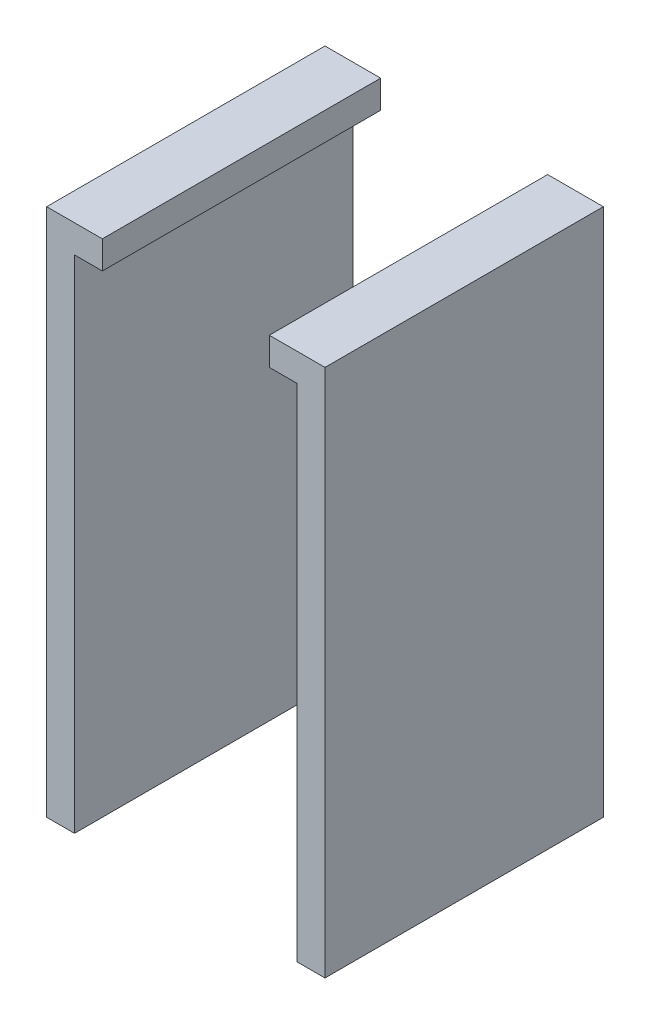
ISO-10303-21;
HEADER;
FILE_DESCRIPTION(('STEP AP214'),'2;1');
FILE_NAME('part.step','',(''),(''),'','','');
FILE_SCHEMA(('AUTOMOTIVE_DESIGN { 1 0 10303 214 1 1 1 1 }'));
ENDSEC;
DATA;
#1=APPLICATION_CONTEXT('core data for automotive mechanical design processes');
#2=APPLICATION_PROTOCOL_DEFINITION('international standard','automotive_design',2000,#1);
#3=PRODUCT_CONTEXT('',#1,'mechanical');
#4=PRODUCT('Part','Part','',(#3));
#5=PRODUCT_RELATED_PRODUCT_CATEGORY('part','',(#4));
#6=PRODUCT_DEFINITION_FORMATION('','',#4);
#7=PRODUCT_DEFINITION_CONTEXT('part definition',#1,'design');
#8=PRODUCT_DEFINITION('design','',#6,#7);
#9=PRODUCT_DEFINITION_SHAPE('','',#8);
#10=(LENGTH_UNIT() NAMED_UNIT(*) SI_UNIT(.MILLI.,.METRE.));
#11=(NAMED_UNIT(*) PLANE_ANGLE_UNIT() SI_UNIT($,.RADIAN.));
#12=(NAMED_UNIT(*) SI_UNIT($,.STERADIAN.) SOLID_ANGLE_UNIT());
#13=UNCERTAINTY_MEASURE_WITH_UNIT(LENGTH_MEASURE(1.E-05),#10,'distance_accuracy_value','');
#14=(GEOMETRIC_REPRESENTATION_CONTEXT(3) GLOBAL_UNCERTAINTY_ASSIGNED_CONTEXT((#13)) GLOBAL_UNIT_ASSIGNED_CONTEXT((#10,
#11,#12)) REPRESENTATION_CONTEXT('',''));
#15=CARTESIAN_POINT('',(0.,0.,0.));
#16=DIRECTION('',(0.,0.,1.));
#17=DIRECTION('',(1.,0.,0.));
#18=AXIS2_PLACEMENT_3D('',#15,#16,#17);
#19=CARTESIAN_POINT('',(150.,0.,150.));
#20=DIRECTION('',(0.,1.,0.));
#21=DIRECTION('',(-1.,0.,0.));
#22=AXIS2_PLACEMENT_3D('',#19,#20,#21);
#23=PLANE('',#22);
#24=DIRECTION('',(1.,0.,0.));
#25=VECTOR('',#24,1.);
#26=CARTESIAN_POINT('',(150.,0.,0.));
#27=LINE('',#26,#25);
#28=CARTESIAN_POINT('',(135.,0.,0.));
#29=VERTEX_POINT('',#28);
#30=CARTESIAN_POINT('',(150.,0.,0.));
#31=VERTEX_POINT('',#30);
#32=EDGE_CURVE('E12',#29,#31,#27,.T.);
#33=ORIENTED_EDGE('',*,*,#32,.T.);
#34=DIRECTION('',(0.,0.,-1.));
#35=VECTOR('',#34,1.);
#36=CARTESIAN_POINT('',(150.,0.,150.));
#37=LINE('',#36,#35);
#38=CARTESIAN_POINT('',(150.,0.,150.));
#39=VERTEX_POINT('',#38);
#40=EDGE_CURVE('E149',#39,#31,#37,.T.);
#41=ORIENTED_EDGE('',*,*,#40,.F.);
#42=DIRECTION('',(1.,0.,0.));
#43=VECTOR('',#42,1.);
#44=CARTESIAN_POINT('',(150.,0.,150.));
#45=LINE('',#44,#43);
#46=CARTESIAN_POINT('',(135.,0.,150.));
#47=VERTEX_POINT('',#46);
#48=EDGE_CURVE('E51',#47,#39,#45,.T.);
#49=ORIENTED_EDGE('',*,*,#48,.F.);
#50=DIRECTION('',(0.,0.,-1.));
#51=VECTOR('',#50,1.);
#52=CARTESIAN_POINT('',(135.,0.,150.));
#53=LINE('',#52,#51);
#54=EDGE_CURVE('E137',#47,#29,#53,.T.);
#55=ORIENTED_EDGE('',*,*,#54,.T.);
#56=EDGE_LOOP('',(#33,#41,#49,#55));
#57=FACE_BOUND('',#56,.T.);
#58=ADVANCED_FACE('F47',(#57),#23,.F.);
#59=CARTESIAN_POINT('',(150.,285.,150.));
#60=DIRECTION('',(-1.,0.,0.));
#61=DIRECTION('',(0.,-1.,0.));
#62=AXIS2_PLACEMENT_3D('',#59,#60,#61);
#63=PLANE('',#62);
#64=DIRECTION('',(0.,1.,0.));
#65=VECTOR('',#64,1.);
#66=CARTESIAN_POINT('',(150.,285.,0.));
#67=LINE('',#66,#65);
#68=CARTESIAN_POINT('',(150.,285.,0.));
#69=VERTEX_POINT('',#68);
#70=EDGE_CURVE('E57',#31,#69,#67,.T.);
#71=ORIENTED_EDGE('',*,*,#70,.T.);
#72=DIRECTION('',(0.,0.,-1.));
#73=VECTOR('',#72,1.);
#74=CARTESIAN_POINT('',(150.,285.,150.));
#75=LINE('',#74,#73);
#76=CARTESIAN_POINT('',(150.,285.,150.));
#77=VERTEX_POINT('',#76);
#78=EDGE_CURVE('E115',#77,#69,#75,.T.);
#79=ORIENTED_EDGE('',*,*,#78,.F.);
#80=DIRECTION('',(0.,1.,0.));
#81=VECTOR('',#80,1.);
#82=CARTESIAN_POINT('',(150.,285.,150.));
#83=LINE('',#82,#81);
#84=EDGE_CURVE('E87',#39,#77,#83,.T.);
#85=ORIENTED_EDGE('',*,*,#84,.F.);
#86=ORIENTED_EDGE('',*,*,#40,.T.);
#87=EDGE_LOOP('',(#71,#79,#85,#86));
#88=FACE_BOUND('',#87,.T.);
#89=ADVANCED_FACE('F150',(#88),#63,.F.);
#90=CARTESIAN_POINT('',(120.,285.,150.));
#91=DIRECTION('',(0.,-1.,0.));
#92=DIRECTION('',(0.,0.,-1.));
#93=AXIS2_PLACEMENT_3D('',#90,#91,#92);
#94=PLANE('',#93);
#95=DIRECTION('',(-1.,0.,0.));
#96=VECTOR('',#95,1.);
#97=CARTESIAN_POINT('',(120.,285.,0.));
#98=LINE('',#97,#96);
#99=CARTESIAN_POINT('',(120.,285.,0.));
#100=VERTEX_POINT('',#99);
#101=EDGE_CURVE('E109',#69,#100,#98,.T.);
#102=ORIENTED_EDGE('',*,*,#101,.T.);
#103=DIRECTION('',(0.,0.,-1.));
#104=VECTOR('',#103,1.);
#105=CARTESIAN_POINT('',(120.,285.,150.));
#106=LINE('',#105,#104);
#107=CARTESIAN_POINT('',(120.,285.,150.));
#108=VERTEX_POINT('',#107);
#109=EDGE_CURVE('E113',#108,#100,#106,.T.);
#110=ORIENTED_EDGE('',*,*,#109,.F.);
#111=DIRECTION('',(-1.,0.,0.));
#112=VECTOR('',#111,1.);
#113=CARTESIAN_POINT('',(120.,285.,150.));
#114=LINE('',#113,#112);
#115=EDGE_CURVE('E140',#77,#108,#114,.T.);
#116=ORIENTED_EDGE('',*,*,#115,.F.);
#117=ORIENTED_EDGE('',*,*,#78,.T.);
#118=EDGE_LOOP('',(#102,#110,#116,#117));
#119=FACE_BOUND('',#118,.T.);
#120=ADVANCED_FACE('F111',(#119),#94,.F.);
#121=CARTESIAN_POINT('',(120.,270.,150.));
#122=DIRECTION('',(1.,0.,0.));
#123=DIRECTION('',(0.,1.,0.));
#124=AXIS2_PLACEMENT_3D('',#121,#122,#123);
#125=PLANE('',#124);
#126=DIRECTION('',(0.,-1.,0.));
#127=VECTOR('',#126,1.);
#128=CARTESIAN_POINT('',(120.,270.,0.));
#129=LINE('',#128,#127);
#130=CARTESIAN_POINT('',(120.,270.,0.));
#131=VERTEX_POINT('',#130);
#132=EDGE_CURVE('E117',#100,#131,#129,.T.);
#133=ORIENTED_EDGE('',*,*,#132,.T.);
#134=DIRECTION('',(0.,0.,-1.));
#135=VECTOR('',#134,1.);
#136=CARTESIAN_POINT('',(120.,270.,150.));
#137=LINE('',#136,#135);
#138=CARTESIAN_POINT('',(120.,270.,150.));
#139=VERTEX_POINT('',#138);
#140=EDGE_CURVE('E124',#139,#131,#137,.T.);
#141=ORIENTED_EDGE('',*,*,#140,.F.);
#142=DIRECTION('',(0.,-1.,0.));
#143=VECTOR('',#142,1.);
#144=CARTESIAN_POINT('',(120.,270.,150.));
#145=LINE('',#144,#143);
#146=EDGE_CURVE('E123',#108,#139,#145,.T.);
#147=ORIENTED_EDGE('',*,*,#146,.F.);
#148=ORIENTED_EDGE('',*,*,#109,.T.);
#149=EDGE_LOOP('',(#133,#141,#147,#148));
#150=FACE_BOUND('',#149,.T.);
#151=ADVANCED_FACE('F120',(#150),#125,.F.);
#152=CARTESIAN_POINT('',(135.,270.,150.));
#153=DIRECTION('',(0.,1.,0.));
#154=DIRECTION('',(-1.,0.,0.));
#155=AXIS2_PLACEMENT_3D('',#152,#153,#154);
#156=PLANE('',#155);
#157=DIRECTION('',(1.,0.,0.));
#158=VECTOR('',#157,1.);
#159=CARTESIAN_POINT('',(135.,270.,0.));
#160=LINE('',#159,#158);
#161=CARTESIAN_POINT('',(135.,270.,0.));
#162=VERTEX_POINT('',#161);
#163=EDGE_CURVE('E128',#131,#162,#160,.T.);
#164=ORIENTED_EDGE('',*,*,#163,.T.);
#165=DIRECTION('',(0.,0.,-1.));
#166=VECTOR('',#165,1.);
#167=CARTESIAN_POINT('',(135.,270.,150.));
#168=LINE('',#167,#166);
#169=CARTESIAN_POINT('',(135.,270.,150.));
#170=VERTEX_POINT('',#169);
#171=EDGE_CURVE('E145',#170,#162,#168,.T.);
#172=ORIENTED_EDGE('',*,*,#171,.F.);
#173=DIRECTION('',(1.,0.,0.));
#174=VECTOR('',#173,1.);
#175=CARTESIAN_POINT('',(135.,270.,150.));
#176=LINE('',#175,#174);
#177=EDGE_CURVE('E136',#139,#170,#176,.T.);
#178=ORIENTED_EDGE('',*,*,#177,.F.);
#179=ORIENTED_EDGE('',*,*,#140,.T.);
#180=EDGE_LOOP('',(#164,#172,#178,#179));
#181=FACE_BOUND('',#180,.T.);
#182=ADVANCED_FACE('F157',(#181),#156,.F.);
#183=CARTESIAN_POINT('',(135.,0.,150.));
#184=DIRECTION('',(1.,0.,0.));
#185=DIRECTION('',(0.,0.,-1.));
#186=AXIS2_PLACEMENT_3D('',#183,#184,#185);
#187=PLANE('',#186);
#188=DIRECTION('',(0.,-1.,0.));
#189=VECTOR('',#188,1.);
#190=CARTESIAN_POINT('',(135.,0.,0.));
#191=LINE('',#190,#189);
#192=EDGE_CURVE('E98',#162,#29,#191,.T.);
#193=ORIENTED_EDGE('',*,*,#192,.T.);
#194=ORIENTED_EDGE('',*,*,#54,.F.);
#195=DIRECTION('',(0.,-1.,0.));
#196=VECTOR('',#195,1.);
#197=CARTESIAN_POINT('',(135.,0.,150.));
#198=LINE('',#197,#196);
#199=EDGE_CURVE('E134',#170,#47,#198,.T.);
#200=ORIENTED_EDGE('',*,*,#199,.F.);
#201=ORIENTED_EDGE('',*,*,#171,.T.);
#202=EDGE_LOOP('',(#193,#194,#200,#201));
#203=FACE_BOUND('',#202,.T.);
#204=ADVANCED_FACE('F153',(#203),#187,.F.);
#205=CARTESIAN_POINT('',(0.,0.,150.));
#206=DIRECTION('',(0.,0.,-1.));
#207=DIRECTION('',(-1.,0.,0.));
#208=AXIS2_PLACEMENT_3D('',#205,#206,#207);
#209=PLANE('',#208);
#210=ORIENTED_EDGE('',*,*,#48,.T.);
#211=ORIENTED_EDGE('',*,*,#84,.T.);
#212=ORIENTED_EDGE('',*,*,#115,.T.);
#213=ORIENTED_EDGE('',*,*,#146,.T.);
#214=ORIENTED_EDGE('',*,*,#177,.T.);
#215=ORIENTED_EDGE('',*,*,#199,.T.);
#216=EDGE_LOOP('',(#210,#211,#212,#213,#214,#215));
#217=FACE_BOUND('',#216,.T.);
#218=ADVANCED_FACE('F49',(#217),#209,.F.);
#219=CARTESIAN_POINT('',(0.,0.,0.));
#220=DIRECTION('',(0.,0.,-1.));
#221=DIRECTION('',(-1.,0.,0.));
#222=AXIS2_PLACEMENT_3D('',#219,#220,#221);
#223=PLANE('',#222);
#224=ORIENTED_EDGE('',*,*,#32,.F.);
#225=ORIENTED_EDGE('',*,*,#192,.F.);
#226=ORIENTED_EDGE('',*,*,#163,.F.);
#227=ORIENTED_EDGE('',*,*,#132,.F.);
#228=ORIENTED_EDGE('',*,*,#101,.F.);
#229=ORIENTED_EDGE('',*,*,#70,.F.);
#230=EDGE_LOOP('',(#224,#225,#226,#227,#228,#229));
#231=FACE_BOUND('',#230,.T.);
#232=ADVANCED_FACE('F127',(#231),#223,.T.);
#233=CLOSED_SHELL('',(#58,#89,#120,#151,#182,#204,#218,#232));
#234=MANIFOLD_SOLID_BREP('B2',#233);
#235=CARTESIAN_POINT('',(15.,0.,150.));
#236=DIRECTION('',(0.,1.,0.));
#237=DIRECTION('',(-1.,0.,0.));
#238=AXIS2_PLACEMENT_3D('',#235,#236,#237);
#239=PLANE('',#238);
#240=DIRECTION('',(1.,0.,0.));
#241=VECTOR('',#240,1.);
#242=CARTESIAN_POINT('',(15.,0.,0.));
#243=LINE('',#242,#241);
#244=CARTESIAN_POINT('',(0.,0.,0.));
#245=VERTEX_POINT('',#244);
#246=CARTESIAN_POINT('',(15.,0.,0.));
#247=VERTEX_POINT('',#246);
#248=EDGE_CURVE('E323',#245,#247,#243,.T.);
#249=ORIENTED_EDGE('',*,*,#248,.T.);
#250=DIRECTION('',(0.,0.,-1.));
#251=VECTOR('',#250,1.);
#252=CARTESIAN_POINT('',(15.,0.,150.));
#253=LINE('',#252,#251);
#254=CARTESIAN_POINT('',(15.,0.,150.));
#255=VERTEX_POINT('',#254);
#256=EDGE_CURVE('E45',#255,#247,#253,.T.);
#257=ORIENTED_EDGE('',*,*,#256,.F.);
#258=DIRECTION('',(1.,0.,0.));
#259=VECTOR('',#258,1.);
#260=CARTESIAN_POINT('',(15.,0.,150.));
#261=LINE('',#260,#259);
#262=CARTESIAN_POINT('',(0.,0.,150.));
#263=VERTEX_POINT('',#262);
#264=EDGE_CURVE('E333',#263,#255,#261,.T.);
#265=ORIENTED_EDGE('',*,*,#264,.F.);
#266=DIRECTION('',(0.,0.,-1.));
#267=VECTOR('',#266,1.);
#268=CARTESIAN_POINT('',(0.,0.,150.));
#269=LINE('',#268,#267);
#270=EDGE_CURVE('E319',#263,#245,#269,.T.);
#271=ORIENTED_EDGE('',*,*,#270,.T.);
#272=EDGE_LOOP('',(#249,#257,#265,#271));
#273=FACE_BOUND('',#272,.T.);
#274=ADVANCED_FACE('F239',(#273),#239,.F.);
#275=CARTESIAN_POINT('',(15.,270.,150.));
#276=DIRECTION('',(-1.,0.,0.));
#277=DIRECTION('',(0.,-1.,0.));
#278=AXIS2_PLACEMENT_3D('',#275,#276,#277);
#279=PLANE('',#278);
#280=DIRECTION('',(0.,1.,0.));
#281=VECTOR('',#280,1.);
#282=CARTESIAN_POINT('',(15.,270.,0.));
#283=LINE('',#282,#281);
#284=CARTESIAN_POINT('',(15.,270.,0.));
#285=VERTEX_POINT('',#284);
#286=EDGE_CURVE('E326',#247,#285,#283,.T.);
#287=ORIENTED_EDGE('',*,*,#286,.T.);
#288=DIRECTION('',(0.,0.,-1.));
#289=VECTOR('',#288,1.);
#290=CARTESIAN_POINT('',(15.,270.,150.));
#291=LINE('',#290,#289);
#292=CARTESIAN_POINT('',(15.,270.,150.));
#293=VERTEX_POINT('',#292);
#294=EDGE_CURVE('E247',#293,#285,#291,.T.);
#295=ORIENTED_EDGE('',*,*,#294,.F.);
#296=DIRECTION('',(0.,1.,0.));
#297=VECTOR('',#296,1.);
#298=CARTESIAN_POINT('',(15.,270.,150.));
#299=LINE('',#298,#297);
#300=EDGE_CURVE('E292',#255,#293,#299,.T.);
#301=ORIENTED_EDGE('',*,*,#300,.F.);
#302=ORIENTED_EDGE('',*,*,#256,.T.);
#303=EDGE_LOOP('',(#287,#295,#301,#302));
#304=FACE_BOUND('',#303,.T.);
#305=ADVANCED_FACE('F357',(#304),#279,.F.);
#306=CARTESIAN_POINT('',(30.,270.,150.));
#307=DIRECTION('',(0.,1.,0.));
#308=DIRECTION('',(0.,0.,1.));
#309=AXIS2_PLACEMENT_3D('',#306,#307,#308);
#310=PLANE('',#309);
#311=DIRECTION('',(1.,0.,0.));
#312=VECTOR('',#311,1.);
#313=CARTESIAN_POINT('',(30.,270.,0.));
#314=LINE('',#313,#312);
#315=CARTESIAN_POINT('',(30.,270.,0.));
#316=VERTEX_POINT('',#315);
#317=EDGE_CURVE('E328',#285,#316,#314,.T.);
#318=ORIENTED_EDGE('',*,*,#317,.T.);
#319=DIRECTION('',(0.,0.,-1.));
#320=VECTOR('',#319,1.);
#321=CARTESIAN_POINT('',(30.,270.,150.));
#322=LINE('',#321,#320);
#323=CARTESIAN_POINT('',(30.,270.,150.));
#324=VERTEX_POINT('',#323);
#325=EDGE_CURVE('E314',#324,#316,#322,.T.);
#326=ORIENTED_EDGE('',*,*,#325,.F.);
#327=DIRECTION('',(1.,0.,0.));
#328=VECTOR('',#327,1.);
#329=CARTESIAN_POINT('',(30.,270.,150.));
#330=LINE('',#329,#328);
#331=EDGE_CURVE('E305',#293,#324,#330,.T.);
#332=ORIENTED_EDGE('',*,*,#331,.F.);
#333=ORIENTED_EDGE('',*,*,#294,.T.);
#334=EDGE_LOOP('',(#318,#326,#332,#333));
#335=FACE_BOUND('',#334,.T.);
#336=ADVANCED_FACE('F339',(#335),#310,.F.);
#337=CARTESIAN_POINT('',(30.,285.,150.));
#338=DIRECTION('',(-1.,0.,0.));
#339=DIRECTION('',(0.,-1.,0.));
#340=AXIS2_PLACEMENT_3D('',#337,#338,#339);
#341=PLANE('',#340);
#342=DIRECTION('',(0.,1.,0.));
#343=VECTOR('',#342,1.);
#344=CARTESIAN_POINT('',(30.,285.,0.));
#345=LINE('',#344,#343);
#346=CARTESIAN_POINT('',(30.,285.,0.));
#347=VERTEX_POINT('',#346);
#348=EDGE_CURVE('E313',#316,#347,#345,.T.);
#349=ORIENTED_EDGE('',*,*,#348,.T.);
#350=DIRECTION('',(0.,0.,-1.));
#351=VECTOR('',#350,1.);
#352=CARTESIAN_POINT('',(30.,285.,150.));
#353=LINE('',#352,#351);
#354=CARTESIAN_POINT('',(30.,285.,150.));
#355=VERTEX_POINT('',#354);
#356=EDGE_CURVE('E310',#355,#347,#353,.T.);
#357=ORIENTED_EDGE('',*,*,#356,.F.);
#358=DIRECTION('',(0.,1.,0.));
#359=VECTOR('',#358,1.);
#360=CARTESIAN_POINT('',(30.,285.,150.));
#361=LINE('',#360,#359);
#362=EDGE_CURVE('E299',#324,#355,#361,.T.);
#363=ORIENTED_EDGE('',*,*,#362,.F.);
#364=ORIENTED_EDGE('',*,*,#325,.T.);
#365=EDGE_LOOP('',(#349,#357,#363,#364));
#366=FACE_BOUND('',#365,.T.);
#367=ADVANCED_FACE('F311',(#366),#341,.F.);
#368=CARTESIAN_POINT('',(0.,285.,150.));
#369=DIRECTION('',(0.,-1.,0.));
#370=DIRECTION('',(0.,0.,-1.));
#371=AXIS2_PLACEMENT_3D('',#368,#369,#370);
#372=PLANE('',#371);
#373=DIRECTION('',(-1.,0.,0.));
#374=VECTOR('',#373,1.);
#375=CARTESIAN_POINT('',(0.,285.,0.));
#376=LINE('',#375,#374);
#377=CARTESIAN_POINT('',(0.,285.,0.));
#378=VERTEX_POINT('',#377);
#379=EDGE_CURVE('E278',#347,#378,#376,.T.);
#380=ORIENTED_EDGE('',*,*,#379,.T.);
#381=DIRECTION('',(0.,0.,-1.));
#382=VECTOR('',#381,1.);
#383=CARTESIAN_POINT('',(0.,285.,150.));
#384=LINE('',#383,#382);
#385=CARTESIAN_POINT('',(0.,285.,150.));
#386=VERTEX_POINT('',#385);
#387=EDGE_CURVE('E315',#386,#378,#384,.T.);
#388=ORIENTED_EDGE('',*,*,#387,.F.);
#389=DIRECTION('',(-1.,0.,0.));
#390=VECTOR('',#389,1.);
#391=CARTESIAN_POINT('',(0.,285.,150.));
#392=LINE('',#391,#390);
#393=EDGE_CURVE('E303',#355,#386,#392,.T.);
#394=ORIENTED_EDGE('',*,*,#393,.F.);
#395=ORIENTED_EDGE('',*,*,#356,.T.);
#396=EDGE_LOOP('',(#380,#388,#394,#395));
#397=FACE_BOUND('',#396,.T.);
#398=ADVANCED_FACE('F317',(#397),#372,.F.);
#399=CARTESIAN_POINT('',(0.,0.,150.));
#400=DIRECTION('',(1.,0.,0.));
#401=DIRECTION('',(0.,1.,0.));
#402=AXIS2_PLACEMENT_3D('',#399,#400,#401);
#403=PLANE('',#402);
#404=DIRECTION('',(0.,-1.,0.));
#405=VECTOR('',#404,1.);
#406=CARTESIAN_POINT('',(0.,0.,0.));
#407=LINE('',#406,#405);
#408=EDGE_CURVE('E284',#378,#245,#407,.T.);
#409=ORIENTED_EDGE('',*,*,#408,.T.);
#410=ORIENTED_EDGE('',*,*,#270,.F.);
#411=DIRECTION('',(0.,-1.,0.));
#412=VECTOR('',#411,1.);
#413=CARTESIAN_POINT('',(0.,0.,150.));
#414=LINE('',#413,#412);
#415=EDGE_CURVE('E255',#386,#263,#414,.T.);
#416=ORIENTED_EDGE('',*,*,#415,.F.);
#417=ORIENTED_EDGE('',*,*,#387,.T.);
#418=EDGE_LOOP('',(#409,#410,#416,#417));
#419=FACE_BOUND('',#418,.T.);
#420=ADVANCED_FACE('F346',(#419),#403,.F.);
#421=CARTESIAN_POINT('',(0.,0.,150.));
#422=DIRECTION('',(0.,0.,-1.));
#423=DIRECTION('',(-1.,0.,0.));
#424=AXIS2_PLACEMENT_3D('',#421,#422,#423);
#425=PLANE('',#424);
#426=ORIENTED_EDGE('',*,*,#264,.T.);
#427=ORIENTED_EDGE('',*,*,#300,.T.);
#428=ORIENTED_EDGE('',*,*,#331,.T.);
#429=ORIENTED_EDGE('',*,*,#362,.T.);
#430=ORIENTED_EDGE('',*,*,#393,.T.);
#431=ORIENTED_EDGE('',*,*,#415,.T.);
#432=EDGE_LOOP('',(#426,#427,#428,#429,#430,#431));
#433=FACE_BOUND('',#432,.T.);
#434=ADVANCED_FACE('F301',(#433),#425,.F.);
#435=CARTESIAN_POINT('',(0.,0.,0.));
#436=DIRECTION('',(0.,0.,-1.));
#437=DIRECTION('',(-1.,0.,0.));
#438=AXIS2_PLACEMENT_3D('',#435,#436,#437);
#439=PLANE('',#438);
#440=ORIENTED_EDGE('',*,*,#248,.F.);
#441=ORIENTED_EDGE('',*,*,#408,.F.);
#442=ORIENTED_EDGE('',*,*,#379,.F.);
#443=ORIENTED_EDGE('',*,*,#348,.F.);
#444=ORIENTED_EDGE('',*,*,#317,.F.);
#445=ORIENTED_EDGE('',*,*,#286,.F.);
#446=EDGE_LOOP('',(#440,#441,#442,#443,#444,#445));
#447=FACE_BOUND('',#446,.T.);
#448=ADVANCED_FACE('F342',(#447),#439,.T.);
#449=CLOSED_SHELL('',(#274,#305,#336,#367,#398,#420,#434,#448));
#450=MANIFOLD_SOLID_BREP('B6',#449);
#451=ADVANCED_BREP_SHAPE_REPRESENTATION('',(#18,#234,#450),#14);
#452=SHAPE_DEFINITION_REPRESENTATION(#9,#451);
ENDSEC;
END-ISO-10303-21;
